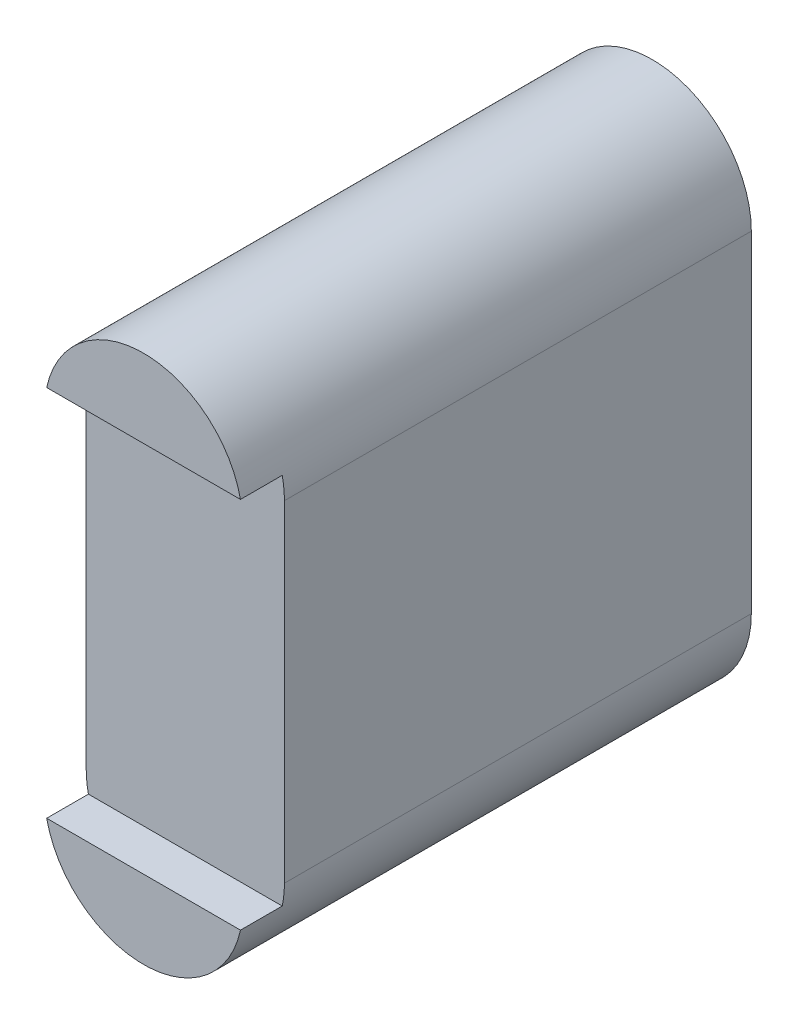
ISO-10303-21;
HEADER;
FILE_DESCRIPTION(('STEP AP214'),'2;1');
FILE_NAME('part.step','',(''),(''),'','','');
FILE_SCHEMA(('AUTOMOTIVE_DESIGN { 1 0 10303 214 1 1 1 1 }'));
ENDSEC;
DATA;
#1=APPLICATION_CONTEXT('core data for automotive mechanical design processes');
#2=APPLICATION_PROTOCOL_DEFINITION('international standard','automotive_design',2000,#1);
#3=PRODUCT_CONTEXT('',#1,'mechanical');
#4=PRODUCT('Part','Part','',(#3));
#5=PRODUCT_RELATED_PRODUCT_CATEGORY('part','',(#4));
#6=PRODUCT_DEFINITION_FORMATION('','',#4);
#7=PRODUCT_DEFINITION_CONTEXT('part definition',#1,'design');
#8=PRODUCT_DEFINITION('design','',#6,#7);
#9=PRODUCT_DEFINITION_SHAPE('','',#8);
#10=(LENGTH_UNIT() NAMED_UNIT(*) SI_UNIT(.MILLI.,.METRE.));
#11=(NAMED_UNIT(*) PLANE_ANGLE_UNIT() SI_UNIT($,.RADIAN.));
#12=(NAMED_UNIT(*) SI_UNIT($,.STERADIAN.) SOLID_ANGLE_UNIT());
#13=UNCERTAINTY_MEASURE_WITH_UNIT(LENGTH_MEASURE(1.E-05),#10,'distance_accuracy_value','');
#14=(GEOMETRIC_REPRESENTATION_CONTEXT(3) GLOBAL_UNCERTAINTY_ASSIGNED_CONTEXT((#13)) GLOBAL_UNIT_ASSIGNED_CONTEXT((#10,
#11,#12)) REPRESENTATION_CONTEXT('',''));
#15=CARTESIAN_POINT('',(0.,0.,0.));
#16=DIRECTION('',(0.,0.,1.));
#17=DIRECTION('',(1.,0.,0.));
#18=AXIS2_PLACEMENT_3D('',#15,#16,#17);
#19=CARTESIAN_POINT('',(-38.,-63.5,195.));
#20=DIRECTION('',(-1.,0.,0.));
#21=DIRECTION('',(0.,0.,1.));
#22=AXIS2_PLACEMENT_3D('',#19,#20,#21);
#23=PLANE('',#22);
#24=DIRECTION('',(0.,0.,-1.));
#25=VECTOR('',#24,1.);
#26=CARTESIAN_POINT('',(-38.,-63.5,195.));
#27=LINE('',#26,#25);
#28=CARTESIAN_POINT('',(-38.,-63.5,179.));
#29=VERTEX_POINT('',#28);
#30=CARTESIAN_POINT('',(-38.,-63.5,0.));
#31=VERTEX_POINT('',#30);
#32=EDGE_CURVE('E55',#29,#31,#27,.T.);
#33=ORIENTED_EDGE('',*,*,#32,.F.);
#34=DIRECTION('',(0.,-1.,0.));
#35=VECTOR('',#34,1.);
#36=CARTESIAN_POINT('',(-38.,71.5,179.));
#37=LINE('',#36,#35);
#38=CARTESIAN_POINT('',(-38.,63.5,179.));
#39=VERTEX_POINT('',#38);
#40=EDGE_CURVE('E164',#39,#29,#37,.T.);
#41=ORIENTED_EDGE('',*,*,#40,.F.);
#42=DIRECTION('',(0.,0.,-1.));
#43=VECTOR('',#42,1.);
#44=CARTESIAN_POINT('',(-38.,63.5,195.));
#45=LINE('',#44,#43);
#46=CARTESIAN_POINT('',(-38.,63.5,0.));
#47=VERTEX_POINT('',#46);
#48=EDGE_CURVE('E115',#39,#47,#45,.T.);
#49=ORIENTED_EDGE('',*,*,#48,.T.);
#50=DIRECTION('',(0.,1.,0.));
#51=VECTOR('',#50,1.);
#52=CARTESIAN_POINT('',(-38.,-63.5,0.));
#53=LINE('',#52,#51);
#54=EDGE_CURVE('E125',#31,#47,#53,.T.);
#55=ORIENTED_EDGE('',*,*,#54,.F.);
#56=EDGE_LOOP('',(#33,#41,#49,#55));
#57=FACE_BOUND('',#56,.T.);
#58=ADVANCED_FACE('F33',(#57),#23,.T.);
#59=CARTESIAN_POINT('',(38.,-63.5,195.));
#60=DIRECTION('',(-1.,0.,0.));
#61=DIRECTION('',(0.,0.,1.));
#62=AXIS2_PLACEMENT_3D('',#59,#60,#61);
#63=PLANE('',#62);
#64=DIRECTION('',(0.,1.,0.));
#65=VECTOR('',#64,1.);
#66=CARTESIAN_POINT('',(38.,71.5,179.));
#67=LINE('',#66,#65);
#68=CARTESIAN_POINT('',(38.,-63.5,179.));
#69=VERTEX_POINT('',#68);
#70=CARTESIAN_POINT('',(38.,63.5,179.));
#71=VERTEX_POINT('',#70);
#72=EDGE_CURVE('E156',#69,#71,#67,.T.);
#73=ORIENTED_EDGE('',*,*,#72,.F.);
#74=DIRECTION('',(0.,0.,-1.));
#75=VECTOR('',#74,1.);
#76=CARTESIAN_POINT('',(38.,-63.5,195.));
#77=LINE('',#76,#75);
#78=CARTESIAN_POINT('',(38.,-63.5,0.));
#79=VERTEX_POINT('',#78);
#80=EDGE_CURVE('E137',#69,#79,#77,.T.);
#81=ORIENTED_EDGE('',*,*,#80,.T.);
#82=DIRECTION('',(0.,1.,0.));
#83=VECTOR('',#82,1.);
#84=CARTESIAN_POINT('',(38.,-63.5,0.));
#85=LINE('',#84,#83);
#86=CARTESIAN_POINT('',(38.,63.5,0.));
#87=VERTEX_POINT('',#86);
#88=EDGE_CURVE('E132',#79,#87,#85,.T.);
#89=ORIENTED_EDGE('',*,*,#88,.T.);
#90=DIRECTION('',(0.,0.,-1.));
#91=VECTOR('',#90,1.);
#92=CARTESIAN_POINT('',(38.,63.5,195.));
#93=LINE('',#92,#91);
#94=EDGE_CURVE('E118',#71,#87,#93,.T.);
#95=ORIENTED_EDGE('',*,*,#94,.F.);
#96=EDGE_LOOP('',(#73,#81,#89,#95));
#97=FACE_BOUND('',#96,.T.);
#98=ADVANCED_FACE('F155',(#97),#63,.F.);
#99=CARTESIAN_POINT('',(0.,63.5,195.));
#100=DIRECTION('',(0.,0.,-1.));
#101=DIRECTION('',(-1.,0.,0.));
#102=AXIS2_PLACEMENT_3D('',#99,#100,#101);
#103=PLANE('',#102);
#104=CARTESIAN_POINT('',(0.,63.5,195.));
#105=DIRECTION('',(0.,0.,-1.));
#106=DIRECTION('',(-1.,0.,0.));
#107=AXIS2_PLACEMENT_3D('',#104,#105,#106);
#108=CIRCLE('',#107,38.);
#109=CARTESIAN_POINT('',(-37.1483512420134,71.5,195.));
#110=VERTEX_POINT('',#109);
#111=CARTESIAN_POINT('',(37.1483512420134,71.5,195.));
#112=VERTEX_POINT('',#111);
#113=EDGE_CURVE('E116',#110,#112,#108,.T.);
#114=ORIENTED_EDGE('',*,*,#113,.F.);
#115=DIRECTION('',(1.,0.,0.));
#116=VECTOR('',#115,1.);
#117=CARTESIAN_POINT('',(0.,71.5,195.));
#118=LINE('',#117,#116);
#119=EDGE_CURVE('E105',#110,#112,#118,.T.);
#120=ORIENTED_EDGE('',*,*,#119,.T.);
#121=EDGE_LOOP('',(#114,#120));
#122=FACE_BOUND('',#121,.T.);
#123=ADVANCED_FACE('F189',(#122),#103,.F.);
#124=CARTESIAN_POINT('',(0.,-63.5,195.));
#125=DIRECTION('',(0.,0.,-1.));
#126=DIRECTION('',(-1.,0.,0.));
#127=AXIS2_PLACEMENT_3D('',#124,#125,#126);
#128=CYLINDRICAL_SURFACE('',#127,38.);
#129=CARTESIAN_POINT('',(0.,-63.5,195.));
#130=DIRECTION('',(0.,0.,1.));
#131=DIRECTION('',(1.,0.,0.));
#132=AXIS2_PLACEMENT_3D('',#129,#130,#131);
#133=CIRCLE('',#132,38.);
#134=CARTESIAN_POINT('',(-37.1483512420134,-71.5,195.));
#135=VERTEX_POINT('',#134);
#136=CARTESIAN_POINT('',(37.1483512420134,-71.5,195.));
#137=VERTEX_POINT('',#136);
#138=EDGE_CURVE('E109',#135,#137,#133,.T.);
#139=ORIENTED_EDGE('',*,*,#138,.F.);
#140=DIRECTION('',(0.,0.,-1.));
#141=VECTOR('',#140,1.);
#142=CARTESIAN_POINT('',(-37.1483512420134,-71.5,195.));
#143=LINE('',#142,#141);
#144=CARTESIAN_POINT('',(-37.1483512420134,-71.5,179.));
#145=VERTEX_POINT('',#144);
#146=EDGE_CURVE('E47',#135,#145,#143,.T.);
#147=ORIENTED_EDGE('',*,*,#146,.T.);
#148=CARTESIAN_POINT('',(0.,-63.5,179.));
#149=DIRECTION('',(0.,0.,1.));
#150=DIRECTION('',(1.,0.,0.));
#151=AXIS2_PLACEMENT_3D('',#148,#149,#150);
#152=CIRCLE('',#151,38.);
#153=EDGE_CURVE('E129',#29,#145,#152,.T.);
#154=ORIENTED_EDGE('',*,*,#153,.F.);
#155=ORIENTED_EDGE('',*,*,#32,.T.);
#156=CARTESIAN_POINT('',(0.,-63.5,0.));
#157=DIRECTION('',(0.,0.,1.));
#158=DIRECTION('',(1.,0.,0.));
#159=AXIS2_PLACEMENT_3D('',#156,#157,#158);
#160=CIRCLE('',#159,38.);
#161=EDGE_CURVE('E121',#31,#79,#160,.T.);
#162=ORIENTED_EDGE('',*,*,#161,.T.);
#163=ORIENTED_EDGE('',*,*,#80,.F.);
#164=CARTESIAN_POINT('',(37.1483512420134,-71.5,179.));
#165=VERTEX_POINT('',#164);
#166=EDGE_CURVE('E111',#165,#69,#152,.T.);
#167=ORIENTED_EDGE('',*,*,#166,.F.);
#168=DIRECTION('',(0.,0.,-1.));
#169=VECTOR('',#168,1.);
#170=CARTESIAN_POINT('',(37.1483512420134,-71.5,195.));
#171=LINE('',#170,#169);
#172=EDGE_CURVE('E100',#165,#137,#171,.F.);
#173=ORIENTED_EDGE('',*,*,#172,.T.);
#174=EDGE_LOOP('',(#139,#147,#154,#155,#162,#163,#167,#173));
#175=FACE_BOUND('',#174,.T.);
#176=ADVANCED_FACE('F108',(#175),#128,.T.);
#177=CARTESIAN_POINT('',(0.,63.5,195.));
#178=DIRECTION('',(0.,0.,-1.));
#179=DIRECTION('',(-1.,0.,0.));
#180=AXIS2_PLACEMENT_3D('',#177,#178,#179);
#181=CYLINDRICAL_SURFACE('',#180,38.);
#182=DIRECTION('',(0.,0.,-1.));
#183=VECTOR('',#182,1.);
#184=CARTESIAN_POINT('',(-37.1483512420134,71.5,195.));
#185=LINE('',#184,#183);
#186=CARTESIAN_POINT('',(-37.1483512420134,71.5,179.));
#187=VERTEX_POINT('',#186);
#188=EDGE_CURVE('E172',#110,#187,#185,.T.);
#189=ORIENTED_EDGE('',*,*,#188,.F.);
#190=ORIENTED_EDGE('',*,*,#113,.T.);
#191=DIRECTION('',(0.,0.,-1.));
#192=VECTOR('',#191,1.);
#193=CARTESIAN_POINT('',(37.1483512420134,71.5,195.));
#194=LINE('',#193,#192);
#195=CARTESIAN_POINT('',(37.1483512420134,71.5,179.));
#196=VERTEX_POINT('',#195);
#197=EDGE_CURVE('E149',#196,#112,#194,.F.);
#198=ORIENTED_EDGE('',*,*,#197,.F.);
#199=CARTESIAN_POINT('',(0.,63.5,179.));
#200=DIRECTION('',(0.,0.,1.));
#201=DIRECTION('',(1.,0.,0.));
#202=AXIS2_PLACEMENT_3D('',#199,#200,#201);
#203=CIRCLE('',#202,38.);
#204=EDGE_CURVE('E36',#196,#71,#203,.F.);
#205=ORIENTED_EDGE('',*,*,#204,.T.);
#206=ORIENTED_EDGE('',*,*,#94,.T.);
#207=CARTESIAN_POINT('',(0.,63.5,0.));
#208=DIRECTION('',(0.,0.,-1.));
#209=DIRECTION('',(-1.,0.,0.));
#210=AXIS2_PLACEMENT_3D('',#207,#208,#209);
#211=CIRCLE('',#210,38.);
#212=EDGE_CURVE('E128',#47,#87,#211,.T.);
#213=ORIENTED_EDGE('',*,*,#212,.F.);
#214=ORIENTED_EDGE('',*,*,#48,.F.);
#215=EDGE_CURVE('E11',#39,#187,#203,.F.);
#216=ORIENTED_EDGE('',*,*,#215,.T.);
#217=EDGE_LOOP('',(#189,#190,#198,#205,#206,#213,#214,#216));
#218=FACE_BOUND('',#217,.T.);
#219=ADVANCED_FACE('F147',(#218),#181,.T.);
#220=ORIENTED_EDGE('',*,*,#138,.T.);
#221=DIRECTION('',(-1.,0.,0.));
#222=VECTOR('',#221,1.);
#223=CARTESIAN_POINT('',(0.,-71.5,195.));
#224=LINE('',#223,#222);
#225=EDGE_CURVE('E97',#137,#135,#224,.T.);
#226=ORIENTED_EDGE('',*,*,#225,.T.);
#227=EDGE_LOOP('',(#220,#226));
#228=FACE_BOUND('',#227,.T.);
#229=ADVANCED_FACE('F114',(#228),#103,.F.);
#230=CARTESIAN_POINT('',(0.,63.5,0.));
#231=DIRECTION('',(0.,0.,-1.));
#232=DIRECTION('',(-1.,0.,0.));
#233=AXIS2_PLACEMENT_3D('',#230,#231,#232);
#234=PLANE('',#233);
#235=ORIENTED_EDGE('',*,*,#54,.T.);
#236=ORIENTED_EDGE('',*,*,#212,.T.);
#237=ORIENTED_EDGE('',*,*,#88,.F.);
#238=ORIENTED_EDGE('',*,*,#161,.F.);
#239=EDGE_LOOP('',(#235,#236,#237,#238));
#240=FACE_BOUND('',#239,.T.);
#241=ADVANCED_FACE('F159',(#240),#234,.T.);
#242=CARTESIAN_POINT('',(0.,0.,179.));
#243=DIRECTION('',(0.,0.,1.));
#244=DIRECTION('',(1.,0.,0.));
#245=AXIS2_PLACEMENT_3D('',#242,#243,#244);
#246=PLANE('',#245);
#247=ORIENTED_EDGE('',*,*,#153,.T.);
#248=DIRECTION('',(1.,0.,0.));
#249=VECTOR('',#248,1.);
#250=CARTESIAN_POINT('',(-38.,-71.5,179.));
#251=LINE('',#250,#249);
#252=EDGE_CURVE('E165',#145,#165,#251,.T.);
#253=ORIENTED_EDGE('',*,*,#252,.T.);
#254=ORIENTED_EDGE('',*,*,#166,.T.);
#255=ORIENTED_EDGE('',*,*,#72,.T.);
#256=ORIENTED_EDGE('',*,*,#204,.F.);
#257=DIRECTION('',(-1.,0.,0.));
#258=VECTOR('',#257,1.);
#259=CARTESIAN_POINT('',(-38.,71.5,179.));
#260=LINE('',#259,#258);
#261=EDGE_CURVE('E112',#196,#187,#260,.T.);
#262=ORIENTED_EDGE('',*,*,#261,.T.);
#263=ORIENTED_EDGE('',*,*,#215,.F.);
#264=ORIENTED_EDGE('',*,*,#40,.T.);
#265=EDGE_LOOP('',(#247,#253,#254,#255,#256,#262,#263,#264));
#266=FACE_BOUND('',#265,.T.);
#267=ADVANCED_FACE('F174',(#266),#246,.T.);
#268=CARTESIAN_POINT('',(-38.,-71.5,179.));
#269=DIRECTION('',(0.,-1.,0.));
#270=DIRECTION('',(0.,0.,-1.));
#271=AXIS2_PLACEMENT_3D('',#268,#269,#270);
#272=PLANE('',#271);
#273=ORIENTED_EDGE('',*,*,#225,.F.);
#274=ORIENTED_EDGE('',*,*,#172,.F.);
#275=ORIENTED_EDGE('',*,*,#252,.F.);
#276=ORIENTED_EDGE('',*,*,#146,.F.);
#277=EDGE_LOOP('',(#273,#274,#275,#276));
#278=FACE_BOUND('',#277,.T.);
#279=ADVANCED_FACE('F99',(#278),#272,.F.);
#280=CARTESIAN_POINT('',(-38.,71.5,179.));
#281=DIRECTION('',(0.,1.,0.));
#282=DIRECTION('',(0.,0.,1.));
#283=AXIS2_PLACEMENT_3D('',#280,#281,#282);
#284=PLANE('',#283);
#285=ORIENTED_EDGE('',*,*,#197,.T.);
#286=ORIENTED_EDGE('',*,*,#119,.F.);
#287=ORIENTED_EDGE('',*,*,#188,.T.);
#288=ORIENTED_EDGE('',*,*,#261,.F.);
#289=EDGE_LOOP('',(#285,#286,#287,#288));
#290=FACE_BOUND('',#289,.T.);
#291=ADVANCED_FACE('F181',(#290),#284,.F.);
#292=CLOSED_SHELL('',(#58,#98,#123,#176,#219,#229,#241,#267,#279,#291));
#293=MANIFOLD_SOLID_BREP('B2',#292);
#294=ADVANCED_BREP_SHAPE_REPRESENTATION('',(#18,#293),#14);
#295=SHAPE_DEFINITION_REPRESENTATION(#9,#294);
ENDSEC;
END-ISO-10303-21;
